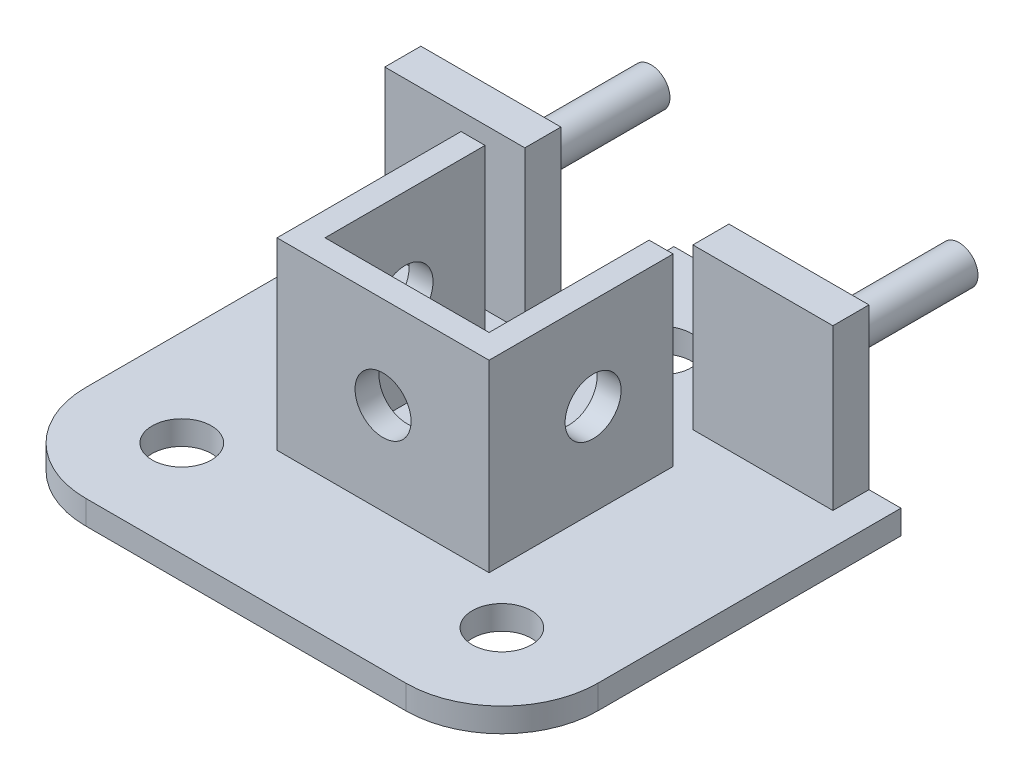
ISO-10303-21;
HEADER;
FILE_DESCRIPTION(('STEP AP214'),'2;1');
FILE_NAME('part.step','',(''),(''),'','','');
FILE_SCHEMA(('AUTOMOTIVE_DESIGN { 1 0 10303 214 1 1 1 1 }'));
ENDSEC;
DATA;
#1=APPLICATION_CONTEXT('core data for automotive mechanical design processes');
#2=APPLICATION_PROTOCOL_DEFINITION('international standard','automotive_design',2000,#1);
#3=PRODUCT_CONTEXT('',#1,'mechanical');
#4=PRODUCT('Part','Part','',(#3));
#5=PRODUCT_RELATED_PRODUCT_CATEGORY('part','',(#4));
#6=PRODUCT_DEFINITION_FORMATION('','',#4);
#7=PRODUCT_DEFINITION_CONTEXT('part definition',#1,'design');
#8=PRODUCT_DEFINITION('design','',#6,#7);
#9=PRODUCT_DEFINITION_SHAPE('','',#8);
#10=(LENGTH_UNIT() NAMED_UNIT(*) SI_UNIT(.MILLI.,.METRE.));
#11=(NAMED_UNIT(*) PLANE_ANGLE_UNIT() SI_UNIT($,.RADIAN.));
#12=(NAMED_UNIT(*) SI_UNIT($,.STERADIAN.) SOLID_ANGLE_UNIT());
#13=UNCERTAINTY_MEASURE_WITH_UNIT(LENGTH_MEASURE(1.E-05),#10,'distance_accuracy_value','');
#14=(GEOMETRIC_REPRESENTATION_CONTEXT(3) GLOBAL_UNCERTAINTY_ASSIGNED_CONTEXT((#13)) GLOBAL_UNIT_ASSIGNED_CONTEXT((#10,
#11,#12)) REPRESENTATION_CONTEXT('',''));
#15=CARTESIAN_POINT('',(0.,0.,0.));
#16=DIRECTION('',(0.,0.,1.));
#17=DIRECTION('',(1.,0.,0.));
#18=AXIS2_PLACEMENT_3D('',#15,#16,#17);
#19=CARTESIAN_POINT('',(0.,3.,0.));
#20=DIRECTION('',(0.,1.,0.));
#21=DIRECTION('',(0.,0.,1.));
#22=AXIS2_PLACEMENT_3D('',#19,#20,#21);
#23=PLANE('',#22);
#24=DIRECTION('',(0.,0.,-1.));
#25=VECTOR('',#24,1.);
#26=CARTESIAN_POINT('',(-13.25,3.,0.));
#27=LINE('',#26,#25);
#28=CARTESIAN_POINT('',(-13.25,3.,-5.15));
#29=VERTEX_POINT('',#28);
#30=CARTESIAN_POINT('',(-13.25,3.,-28.15));
#31=VERTEX_POINT('',#30);
#32=EDGE_CURVE('E212',#29,#31,#27,.T.);
#33=ORIENTED_EDGE('',*,*,#32,.T.);
#34=DIRECTION('',(1.,0.,0.));
#35=VECTOR('',#34,1.);
#36=CARTESIAN_POINT('',(0.,3.,-28.15));
#37=LINE('',#36,#35);
#38=CARTESIAN_POINT('',(-10.25,3.,-28.15));
#39=VERTEX_POINT('',#38);
#40=EDGE_CURVE('E228',#31,#39,#37,.T.);
#41=ORIENTED_EDGE('',*,*,#40,.T.);
#42=DIRECTION('',(0.,0.,-1.));
#43=VECTOR('',#42,1.);
#44=CARTESIAN_POINT('',(-10.25,3.,0.));
#45=LINE('',#44,#43);
#46=CARTESIAN_POINT('',(-10.25,3.,-8.15));
#47=VERTEX_POINT('',#46);
#48=EDGE_CURVE('E230',#47,#39,#45,.T.);
#49=ORIENTED_EDGE('',*,*,#48,.F.);
#50=DIRECTION('',(1.,0.,0.));
#51=VECTOR('',#50,1.);
#52=CARTESIAN_POINT('',(0.,3.,-8.15));
#53=LINE('',#52,#51);
#54=CARTESIAN_POINT('',(10.25,3.,-8.15));
#55=VERTEX_POINT('',#54);
#56=EDGE_CURVE('E257',#47,#55,#53,.T.);
#57=ORIENTED_EDGE('',*,*,#56,.T.);
#58=DIRECTION('',(0.,0.,-1.));
#59=VECTOR('',#58,1.);
#60=CARTESIAN_POINT('',(10.25,3.,0.));
#61=LINE('',#60,#59);
#62=CARTESIAN_POINT('',(10.25,3.,-28.15));
#63=VERTEX_POINT('',#62);
#64=EDGE_CURVE('E255',#55,#63,#61,.T.);
#65=ORIENTED_EDGE('',*,*,#64,.T.);
#66=DIRECTION('',(1.,0.,0.));
#67=VECTOR('',#66,1.);
#68=CARTESIAN_POINT('',(0.,3.,-28.15));
#69=LINE('',#68,#67);
#70=CARTESIAN_POINT('',(13.25,3.,-28.15));
#71=VERTEX_POINT('',#70);
#72=EDGE_CURVE('E253',#63,#71,#69,.T.);
#73=ORIENTED_EDGE('',*,*,#72,.T.);
#74=DIRECTION('',(0.,0.,-1.));
#75=VECTOR('',#74,1.);
#76=CARTESIAN_POINT('',(13.25,3.,0.));
#77=LINE('',#76,#75);
#78=CARTESIAN_POINT('',(13.25,3.,-5.15));
#79=VERTEX_POINT('',#78);
#80=EDGE_CURVE('E60',#79,#71,#77,.T.);
#81=ORIENTED_EDGE('',*,*,#80,.F.);
#82=DIRECTION('',(1.,0.,0.));
#83=VECTOR('',#82,1.);
#84=CARTESIAN_POINT('',(0.,3.,-5.15));
#85=LINE('',#84,#83);
#86=EDGE_CURVE('E55',#29,#79,#85,.T.);
#87=ORIENTED_EDGE('',*,*,#86,.F.);
#88=EDGE_LOOP('',(#33,#41,#49,#57,#65,#73,#81,#87));
#89=FACE_BOUND('',#88,.T.);
#90=DIRECTION('',(0.,0.,-1.));
#91=VECTOR('',#90,1.);
#92=CARTESIAN_POINT('',(-10.5,3.,-37.8767008399383));
#93=LINE('',#92,#91);
#94=CARTESIAN_POINT('',(-10.5,3.,-37.8767008399383));
#95=VERTEX_POINT('',#94);
#96=CARTESIAN_POINT('',(-10.5,3.,-52.));
#97=VERTEX_POINT('',#96);
#98=EDGE_CURVE('E284',#95,#97,#93,.T.);
#99=ORIENTED_EDGE('',*,*,#98,.F.);
#100=DIRECTION('',(0.,0.,-1.));
#101=VECTOR('',#100,1.);
#102=CARTESIAN_POINT('',(-10.5,3.,-37.8767008399383));
#103=LINE('',#102,#101);
#104=CARTESIAN_POINT('',(-10.5,3.,-33.3688732321388));
#105=VERTEX_POINT('',#104);
#106=EDGE_CURVE('E349',#105,#95,#103,.T.);
#107=ORIENTED_EDGE('',*,*,#106,.F.);
#108=DIRECTION('',(1.,0.,0.));
#109=VECTOR('',#108,1.);
#110=CARTESIAN_POINT('',(-28.,3.,-33.3688732321388));
#111=LINE('',#110,#109);
#112=CARTESIAN_POINT('',(-28.,3.,-33.3688732321388));
#113=VERTEX_POINT('',#112);
#114=EDGE_CURVE('E358',#113,#105,#111,.T.);
#115=ORIENTED_EDGE('',*,*,#114,.F.);
#116=DIRECTION('',(0.,0.,1.));
#117=VECTOR('',#116,1.);
#118=CARTESIAN_POINT('',(-28.,3.,-37.8767008399383));
#119=LINE('',#118,#117);
#120=CARTESIAN_POINT('',(-28.,3.,-37.8767008399383));
#121=VERTEX_POINT('',#120);
#122=EDGE_CURVE('E344',#121,#113,#119,.T.);
#123=ORIENTED_EDGE('',*,*,#122,.F.);
#124=DIRECTION('',(1.,0.,0.));
#125=VECTOR('',#124,1.);
#126=CARTESIAN_POINT('',(-32.,3.,-37.8767008399383));
#127=LINE('',#126,#125);
#128=CARTESIAN_POINT('',(-32.,3.,-37.8767008399383));
#129=VERTEX_POINT('',#128);
#130=EDGE_CURVE('E281',#129,#121,#127,.T.);
#131=ORIENTED_EDGE('',*,*,#130,.F.);
#132=DIRECTION('',(0.,0.,-1.));
#133=VECTOR('',#132,1.);
#134=CARTESIAN_POINT('',(-32.,3.,0.));
#135=LINE('',#134,#133);
#136=CARTESIAN_POINT('',(-32.,3.,0.));
#137=VERTEX_POINT('',#136);
#138=EDGE_CURVE('E388',#137,#129,#135,.T.);
#139=ORIENTED_EDGE('',*,*,#138,.F.);
#140=CARTESIAN_POINT('',(-20.,3.,0.));
#141=DIRECTION('',(0.,1.,0.));
#142=DIRECTION('',(0.,0.,1.));
#143=AXIS2_PLACEMENT_3D('',#140,#141,#142);
#144=CIRCLE('',#143,12.);
#145=CARTESIAN_POINT('',(-20.,3.,12.));
#146=VERTEX_POINT('',#145);
#147=EDGE_CURVE('E391',#137,#146,#144,.T.);
#148=ORIENTED_EDGE('',*,*,#147,.T.);
#149=DIRECTION('',(-1.,0.,0.));
#150=VECTOR('',#149,1.);
#151=CARTESIAN_POINT('',(0.,3.,12.));
#152=LINE('',#151,#150);
#153=CARTESIAN_POINT('',(20.,3.,12.));
#154=VERTEX_POINT('',#153);
#155=EDGE_CURVE('E393',#154,#146,#152,.T.);
#156=ORIENTED_EDGE('',*,*,#155,.F.);
#157=CARTESIAN_POINT('',(20.,3.,0.));
#158=DIRECTION('',(0.,1.,0.));
#159=DIRECTION('',(0.,0.,1.));
#160=AXIS2_PLACEMENT_3D('',#157,#158,#159);
#161=CIRCLE('',#160,12.);
#162=CARTESIAN_POINT('',(32.,3.,0.));
#163=VERTEX_POINT('',#162);
#164=EDGE_CURVE('E396',#163,#154,#161,.F.);
#165=ORIENTED_EDGE('',*,*,#164,.F.);
#166=DIRECTION('',(0.,0.,1.));
#167=VECTOR('',#166,1.);
#168=CARTESIAN_POINT('',(32.,3.,0.));
#169=LINE('',#168,#167);
#170=CARTESIAN_POINT('',(32.,3.,-37.8767008399383));
#171=VERTEX_POINT('',#170);
#172=EDGE_CURVE('E383',#171,#163,#169,.T.);
#173=ORIENTED_EDGE('',*,*,#172,.F.);
#174=DIRECTION('',(1.,0.,0.));
#175=VECTOR('',#174,1.);
#176=CARTESIAN_POINT('',(32.,3.,-37.8767008399383));
#177=LINE('',#176,#175);
#178=CARTESIAN_POINT('',(28.,3.,-37.8767008399383));
#179=VERTEX_POINT('',#178);
#180=EDGE_CURVE('E302',#179,#171,#177,.T.);
#181=ORIENTED_EDGE('',*,*,#180,.F.);
#182=DIRECTION('',(0.,0.,-1.));
#183=VECTOR('',#182,1.);
#184=CARTESIAN_POINT('',(28.,3.,-37.8767008399383));
#185=LINE('',#184,#183);
#186=CARTESIAN_POINT('',(28.,3.,-33.3688732321388));
#187=VERTEX_POINT('',#186);
#188=EDGE_CURVE('E321',#187,#179,#185,.T.);
#189=ORIENTED_EDGE('',*,*,#188,.F.);
#190=DIRECTION('',(1.,0.,0.));
#191=VECTOR('',#190,1.);
#192=CARTESIAN_POINT('',(28.,3.,-33.3688732321388));
#193=LINE('',#192,#191);
#194=CARTESIAN_POINT('',(10.5,3.,-33.3688732321388));
#195=VERTEX_POINT('',#194);
#196=EDGE_CURVE('E329',#195,#187,#193,.T.);
#197=ORIENTED_EDGE('',*,*,#196,.F.);
#198=DIRECTION('',(0.,0.,1.));
#199=VECTOR('',#198,1.);
#200=CARTESIAN_POINT('',(10.5,3.,-37.8767008399383));
#201=LINE('',#200,#199);
#202=CARTESIAN_POINT('',(10.5,3.,-37.8767008399383));
#203=VERTEX_POINT('',#202);
#204=EDGE_CURVE('E316',#203,#195,#201,.T.);
#205=ORIENTED_EDGE('',*,*,#204,.F.);
#206=DIRECTION('',(0.,0.,1.));
#207=VECTOR('',#206,1.);
#208=CARTESIAN_POINT('',(10.5,3.,-37.8767008399383));
#209=LINE('',#208,#207);
#210=CARTESIAN_POINT('',(10.5,3.,-52.));
#211=VERTEX_POINT('',#210);
#212=EDGE_CURVE('E300',#211,#203,#209,.T.);
#213=ORIENTED_EDGE('',*,*,#212,.F.);
#214=DIRECTION('',(1.,0.,0.));
#215=VECTOR('',#214,1.);
#216=CARTESIAN_POINT('',(0.,3.,-52.));
#217=LINE('',#216,#215);
#218=EDGE_CURVE('E385',#97,#211,#217,.T.);
#219=ORIENTED_EDGE('',*,*,#218,.F.);
#220=EDGE_LOOP('',(#99,#107,#115,#123,#131,#139,#148,#156,#165,#173,#181,#189,#197,#205,#213,#219));
#221=FACE_BOUND('',#220,.T.);
#222=CARTESIAN_POINT('',(20.,3.,0.));
#223=DIRECTION('',(0.,1.,0.));
#224=DIRECTION('',(0.,0.,1.));
#225=AXIS2_PLACEMENT_3D('',#222,#223,#224);
#226=CIRCLE('',#225,3.7);
#227=CARTESIAN_POINT('',(20.,3.,3.7));
#228=VERTEX_POINT('',#227);
#229=EDGE_CURVE('E373',#228,#228,#226,.T.);
#230=ORIENTED_EDGE('',*,*,#229,.F.);
#231=EDGE_LOOP('',(#230));
#232=FACE_BOUND('',#231,.T.);
#233=CARTESIAN_POINT('',(-20.,3.,0.));
#234=DIRECTION('',(0.,1.,0.));
#235=DIRECTION('',(0.,0.,1.));
#236=AXIS2_PLACEMENT_3D('',#233,#234,#235);
#237=CIRCLE('',#236,3.7);
#238=CARTESIAN_POINT('',(-20.,3.,3.7));
#239=VERTEX_POINT('',#238);
#240=EDGE_CURVE('E376',#239,#239,#237,.T.);
#241=ORIENTED_EDGE('',*,*,#240,.F.);
#242=EDGE_LOOP('',(#241));
#243=FACE_BOUND('',#242,.T.);
#244=CARTESIAN_POINT('',(0.,3.,-40.));
#245=DIRECTION('',(0.,1.,0.));
#246=DIRECTION('',(0.,0.,1.));
#247=AXIS2_PLACEMENT_3D('',#244,#245,#246);
#248=CIRCLE('',#247,3.7);
#249=CARTESIAN_POINT('',(0.,3.,-36.3));
#250=VERTEX_POINT('',#249);
#251=EDGE_CURVE('E380',#250,#250,#248,.T.);
#252=ORIENTED_EDGE('',*,*,#251,.F.);
#253=EDGE_LOOP('',(#252));
#254=FACE_BOUND('',#253,.T.);
#255=ADVANCED_FACE('F39',(#89,#221,#232,#243,#254),#23,.T.);
#256=CARTESIAN_POINT('',(32.,3.,0.));
#257=DIRECTION('',(1.,0.,0.));
#258=DIRECTION('',(0.,0.,-1.));
#259=AXIS2_PLACEMENT_3D('',#256,#257,#258);
#260=PLANE('',#259);
#261=DIRECTION('',(0.,1.,0.));
#262=VECTOR('',#261,1.);
#263=CARTESIAN_POINT('',(32.,-0.00100000000000013,-37.8767008399383));
#264=LINE('',#263,#262);
#265=CARTESIAN_POINT('',(32.,0.,-37.8767008399383));
#266=VERTEX_POINT('',#265);
#267=EDGE_CURVE('E282',#266,#171,#264,.T.);
#268=ORIENTED_EDGE('',*,*,#267,.T.);
#269=ORIENTED_EDGE('',*,*,#172,.T.);
#270=DIRECTION('',(0.,-1.,0.));
#271=VECTOR('',#270,1.);
#272=CARTESIAN_POINT('',(32.,3.,0.));
#273=LINE('',#272,#271);
#274=CARTESIAN_POINT('',(32.,0.,0.));
#275=VERTEX_POINT('',#274);
#276=EDGE_CURVE('E399',#163,#275,#273,.T.);
#277=ORIENTED_EDGE('',*,*,#276,.T.);
#278=DIRECTION('',(0.,0.,1.));
#279=VECTOR('',#278,1.);
#280=CARTESIAN_POINT('',(32.,0.,0.));
#281=LINE('',#280,#279);
#282=EDGE_CURVE('E408',#266,#275,#281,.T.);
#283=ORIENTED_EDGE('',*,*,#282,.F.);
#284=EDGE_LOOP('',(#268,#269,#277,#283));
#285=FACE_BOUND('',#284,.T.);
#286=ADVANCED_FACE('F461',(#285),#260,.T.);
#287=CARTESIAN_POINT('',(0.,3.,-52.));
#288=DIRECTION('',(0.,0.,-1.));
#289=DIRECTION('',(-1.,0.,0.));
#290=AXIS2_PLACEMENT_3D('',#287,#288,#289);
#291=PLANE('',#290);
#292=DIRECTION('',(0.,1.,0.));
#293=VECTOR('',#292,1.);
#294=CARTESIAN_POINT('',(-10.5,-0.00100000000000013,-52.));
#295=LINE('',#294,#293);
#296=CARTESIAN_POINT('',(-10.5,0.,-52.));
#297=VERTEX_POINT('',#296);
#298=EDGE_CURVE('E287',#297,#97,#295,.T.);
#299=ORIENTED_EDGE('',*,*,#298,.T.);
#300=ORIENTED_EDGE('',*,*,#218,.T.);
#301=DIRECTION('',(0.,1.,0.));
#302=VECTOR('',#301,1.);
#303=CARTESIAN_POINT('',(10.5,-0.00100000000000013,-52.));
#304=LINE('',#303,#302);
#305=CARTESIAN_POINT('',(10.5,0.,-52.));
#306=VERTEX_POINT('',#305);
#307=EDGE_CURVE('E304',#306,#211,#304,.T.);
#308=ORIENTED_EDGE('',*,*,#307,.F.);
#309=DIRECTION('',(1.,0.,0.));
#310=VECTOR('',#309,1.);
#311=CARTESIAN_POINT('',(0.,0.,-52.));
#312=LINE('',#311,#310);
#313=EDGE_CURVE('E410',#297,#306,#312,.T.);
#314=ORIENTED_EDGE('',*,*,#313,.F.);
#315=EDGE_LOOP('',(#299,#300,#308,#314));
#316=FACE_BOUND('',#315,.T.);
#317=ADVANCED_FACE('F480',(#316),#291,.T.);
#318=CARTESIAN_POINT('',(-32.,3.,0.));
#319=DIRECTION('',(-1.,0.,0.));
#320=DIRECTION('',(0.,0.,1.));
#321=AXIS2_PLACEMENT_3D('',#318,#319,#320);
#322=PLANE('',#321);
#323=DIRECTION('',(0.,1.,0.));
#324=VECTOR('',#323,1.);
#325=CARTESIAN_POINT('',(-32.,-0.00100000000000013,-37.8767008399383));
#326=LINE('',#325,#324);
#327=CARTESIAN_POINT('',(-32.,0.,-37.8767008399383));
#328=VERTEX_POINT('',#327);
#329=EDGE_CURVE('E286',#328,#129,#326,.T.);
#330=ORIENTED_EDGE('',*,*,#329,.F.);
#331=DIRECTION('',(0.,0.,-1.));
#332=VECTOR('',#331,1.);
#333=CARTESIAN_POINT('',(-32.,0.,0.));
#334=LINE('',#333,#332);
#335=CARTESIAN_POINT('',(-32.,0.,0.));
#336=VERTEX_POINT('',#335);
#337=EDGE_CURVE('E413',#336,#328,#334,.T.);
#338=ORIENTED_EDGE('',*,*,#337,.F.);
#339=DIRECTION('',(0.,-1.,0.));
#340=VECTOR('',#339,1.);
#341=CARTESIAN_POINT('',(-32.,3.,0.));
#342=LINE('',#341,#340);
#343=EDGE_CURVE('E430',#137,#336,#342,.T.);
#344=ORIENTED_EDGE('',*,*,#343,.F.);
#345=ORIENTED_EDGE('',*,*,#138,.T.);
#346=EDGE_LOOP('',(#330,#338,#344,#345));
#347=FACE_BOUND('',#346,.T.);
#348=ADVANCED_FACE('F491',(#347),#322,.T.);
#349=CARTESIAN_POINT('',(-20.,3.,0.));
#350=DIRECTION('',(0.,-1.,0.));
#351=DIRECTION('',(0.,0.,-1.));
#352=AXIS2_PLACEMENT_3D('',#349,#350,#351);
#353=CYLINDRICAL_SURFACE('',#352,12.);
#354=CARTESIAN_POINT('',(-20.,0.,0.));
#355=DIRECTION('',(0.,1.,0.));
#356=DIRECTION('',(0.,0.,1.));
#357=AXIS2_PLACEMENT_3D('',#354,#355,#356);
#358=CIRCLE('',#357,12.);
#359=CARTESIAN_POINT('',(-20.,0.,12.));
#360=VERTEX_POINT('',#359);
#361=EDGE_CURVE('E416',#336,#360,#358,.T.);
#362=ORIENTED_EDGE('',*,*,#361,.T.);
#363=DIRECTION('',(0.,-1.,0.));
#364=VECTOR('',#363,1.);
#365=CARTESIAN_POINT('',(-20.,3.,12.));
#366=LINE('',#365,#364);
#367=EDGE_CURVE('E428',#146,#360,#366,.T.);
#368=ORIENTED_EDGE('',*,*,#367,.F.);
#369=ORIENTED_EDGE('',*,*,#147,.F.);
#370=ORIENTED_EDGE('',*,*,#343,.T.);
#371=EDGE_LOOP('',(#362,#368,#369,#370));
#372=FACE_BOUND('',#371,.T.);
#373=ADVANCED_FACE('F536',(#372),#353,.T.);
#374=CARTESIAN_POINT('',(0.,3.,12.));
#375=DIRECTION('',(0.,0.,1.));
#376=DIRECTION('',(1.,0.,0.));
#377=AXIS2_PLACEMENT_3D('',#374,#375,#376);
#378=PLANE('',#377);
#379=DIRECTION('',(-1.,0.,0.));
#380=VECTOR('',#379,1.);
#381=CARTESIAN_POINT('',(0.,0.,12.));
#382=LINE('',#381,#380);
#383=CARTESIAN_POINT('',(20.,0.,12.));
#384=VERTEX_POINT('',#383);
#385=EDGE_CURVE('E419',#384,#360,#382,.T.);
#386=ORIENTED_EDGE('',*,*,#385,.F.);
#387=DIRECTION('',(0.,-1.,0.));
#388=VECTOR('',#387,1.);
#389=CARTESIAN_POINT('',(20.,3.,12.));
#390=LINE('',#389,#388);
#391=EDGE_CURVE('E426',#154,#384,#390,.T.);
#392=ORIENTED_EDGE('',*,*,#391,.F.);
#393=ORIENTED_EDGE('',*,*,#155,.T.);
#394=ORIENTED_EDGE('',*,*,#367,.T.);
#395=EDGE_LOOP('',(#386,#392,#393,#394));
#396=FACE_BOUND('',#395,.T.);
#397=ADVANCED_FACE('F532',(#396),#378,.T.);
#398=CARTESIAN_POINT('',(0.,3.,-40.));
#399=DIRECTION('',(0.,-1.,0.));
#400=DIRECTION('',(0.,0.,-1.));
#401=AXIS2_PLACEMENT_3D('',#398,#399,#400);
#402=CYLINDRICAL_SURFACE('',#401,3.7);
#403=ORIENTED_EDGE('',*,*,#251,.T.);
#404=EDGE_LOOP('',(#403));
#405=FACE_BOUND('',#404,.T.);
#406=CARTESIAN_POINT('',(0.,0.,-40.));
#407=DIRECTION('',(0.,1.,0.));
#408=DIRECTION('',(0.,0.,1.));
#409=AXIS2_PLACEMENT_3D('',#406,#407,#408);
#410=CIRCLE('',#409,3.7);
#411=CARTESIAN_POINT('',(0.,0.,-36.3));
#412=VERTEX_POINT('',#411);
#413=EDGE_CURVE('E405',#412,#412,#410,.T.);
#414=ORIENTED_EDGE('',*,*,#413,.F.);
#415=EDGE_LOOP('',(#414));
#416=FACE_BOUND('',#415,.T.);
#417=ADVANCED_FACE('F535',(#405,#416),#402,.F.);
#418=CARTESIAN_POINT('',(-20.,3.,0.));
#419=DIRECTION('',(0.,-1.,0.));
#420=DIRECTION('',(0.,0.,-1.));
#421=AXIS2_PLACEMENT_3D('',#418,#419,#420);
#422=CYLINDRICAL_SURFACE('',#421,3.7);
#423=ORIENTED_EDGE('',*,*,#240,.T.);
#424=EDGE_LOOP('',(#423));
#425=FACE_BOUND('',#424,.T.);
#426=CARTESIAN_POINT('',(-20.,0.,0.));
#427=DIRECTION('',(0.,1.,0.));
#428=DIRECTION('',(0.,0.,1.));
#429=AXIS2_PLACEMENT_3D('',#426,#427,#428);
#430=CIRCLE('',#429,3.7);
#431=CARTESIAN_POINT('',(-20.,0.,3.7));
#432=VERTEX_POINT('',#431);
#433=EDGE_CURVE('E402',#432,#432,#430,.T.);
#434=ORIENTED_EDGE('',*,*,#433,.F.);
#435=EDGE_LOOP('',(#434));
#436=FACE_BOUND('',#435,.T.);
#437=ADVANCED_FACE('F546',(#425,#436),#422,.F.);
#438=CARTESIAN_POINT('',(20.,3.,0.));
#439=DIRECTION('',(0.,-1.,0.));
#440=DIRECTION('',(0.,0.,-1.));
#441=AXIS2_PLACEMENT_3D('',#438,#439,#440);
#442=CYLINDRICAL_SURFACE('',#441,3.7);
#443=ORIENTED_EDGE('',*,*,#229,.T.);
#444=EDGE_LOOP('',(#443));
#445=FACE_BOUND('',#444,.T.);
#446=CARTESIAN_POINT('',(20.,0.,0.));
#447=DIRECTION('',(0.,1.,0.));
#448=DIRECTION('',(0.,0.,1.));
#449=AXIS2_PLACEMENT_3D('',#446,#447,#448);
#450=CIRCLE('',#449,3.7);
#451=CARTESIAN_POINT('',(20.,0.,3.7));
#452=VERTEX_POINT('',#451);
#453=EDGE_CURVE('E372',#452,#452,#450,.T.);
#454=ORIENTED_EDGE('',*,*,#453,.F.);
#455=EDGE_LOOP('',(#454));
#456=FACE_BOUND('',#455,.T.);
#457=ADVANCED_FACE('F41',(#445,#456),#442,.F.);
#458=CARTESIAN_POINT('',(20.,3.,0.));
#459=DIRECTION('',(0.,-1.,0.));
#460=DIRECTION('',(0.,0.,-1.));
#461=AXIS2_PLACEMENT_3D('',#458,#459,#460);
#462=CYLINDRICAL_SURFACE('',#461,12.);
#463=CARTESIAN_POINT('',(20.,0.,0.));
#464=DIRECTION('',(0.,1.,0.));
#465=DIRECTION('',(0.,0.,1.));
#466=AXIS2_PLACEMENT_3D('',#463,#464,#465);
#467=CIRCLE('',#466,12.);
#468=EDGE_CURVE('E377',#275,#384,#467,.F.);
#469=ORIENTED_EDGE('',*,*,#468,.F.);
#470=ORIENTED_EDGE('',*,*,#276,.F.);
#471=ORIENTED_EDGE('',*,*,#164,.T.);
#472=ORIENTED_EDGE('',*,*,#391,.T.);
#473=EDGE_LOOP('',(#469,#470,#471,#472));
#474=FACE_BOUND('',#473,.T.);
#475=ADVANCED_FACE('F465',(#474),#462,.T.);
#476=CARTESIAN_POINT('',(0.,0.,0.));
#477=DIRECTION('',(0.,1.,0.));
#478=DIRECTION('',(0.,0.,1.));
#479=AXIS2_PLACEMENT_3D('',#476,#477,#478);
#480=PLANE('',#479);
#481=ORIENTED_EDGE('',*,*,#453,.T.);
#482=EDGE_LOOP('',(#481));
#483=FACE_BOUND('',#482,.T.);
#484=ORIENTED_EDGE('',*,*,#433,.T.);
#485=EDGE_LOOP('',(#484));
#486=FACE_BOUND('',#485,.T.);
#487=ORIENTED_EDGE('',*,*,#413,.T.);
#488=EDGE_LOOP('',(#487));
#489=FACE_BOUND('',#488,.T.);
#490=DIRECTION('',(-1.,0.,0.));
#491=VECTOR('',#490,1.);
#492=CARTESIAN_POINT('',(-32.,0.,-37.8767008399383));
#493=LINE('',#492,#491);
#494=CARTESIAN_POINT('',(-10.5,0.,-37.8767008399383));
#495=VERTEX_POINT('',#494);
#496=EDGE_CURVE('E290',#495,#328,#493,.T.);
#497=ORIENTED_EDGE('',*,*,#496,.F.);
#498=DIRECTION('',(0.,0.,1.));
#499=VECTOR('',#498,1.);
#500=CARTESIAN_POINT('',(-10.5,0.,-37.8767008399383));
#501=LINE('',#500,#499);
#502=EDGE_CURVE('E278',#297,#495,#501,.T.);
#503=ORIENTED_EDGE('',*,*,#502,.F.);
#504=ORIENTED_EDGE('',*,*,#313,.T.);
#505=DIRECTION('',(0.,0.,-1.));
#506=VECTOR('',#505,1.);
#507=CARTESIAN_POINT('',(10.5,0.,-37.8767008399383));
#508=LINE('',#507,#506);
#509=CARTESIAN_POINT('',(10.5,0.,-37.8767008399383));
#510=VERTEX_POINT('',#509);
#511=EDGE_CURVE('E214',#510,#306,#508,.T.);
#512=ORIENTED_EDGE('',*,*,#511,.F.);
#513=DIRECTION('',(-1.,0.,0.));
#514=VECTOR('',#513,1.);
#515=CARTESIAN_POINT('',(32.,0.,-37.8767008399383));
#516=LINE('',#515,#514);
#517=EDGE_CURVE('E297',#266,#510,#516,.T.);
#518=ORIENTED_EDGE('',*,*,#517,.F.);
#519=ORIENTED_EDGE('',*,*,#282,.T.);
#520=ORIENTED_EDGE('',*,*,#468,.T.);
#521=ORIENTED_EDGE('',*,*,#385,.T.);
#522=ORIENTED_EDGE('',*,*,#361,.F.);
#523=ORIENTED_EDGE('',*,*,#337,.T.);
#524=EDGE_LOOP('',(#497,#503,#504,#512,#518,#519,#520,#521,#522,#523));
#525=FACE_BOUND('',#524,.T.);
#526=ADVANCED_FACE('F469',(#483,#486,#489,#525),#480,.F.);
#527=CARTESIAN_POINT('',(-28.,23.,-37.8767008399383));
#528=DIRECTION('',(1.,0.,0.));
#529=DIRECTION('',(0.,0.,-1.));
#530=AXIS2_PLACEMENT_3D('',#527,#528,#529);
#531=PLANE('',#530);
#532=ORIENTED_EDGE('',*,*,#122,.T.);
#533=DIRECTION('',(0.,-1.,0.));
#534=VECTOR('',#533,1.);
#535=CARTESIAN_POINT('',(-28.,23.,-33.3688732321388));
#536=LINE('',#535,#534);
#537=CARTESIAN_POINT('',(-28.,23.,-33.3688732321388));
#538=VERTEX_POINT('',#537);
#539=EDGE_CURVE('E370',#538,#113,#536,.T.);
#540=ORIENTED_EDGE('',*,*,#539,.F.);
#541=DIRECTION('',(0.,0.,1.));
#542=VECTOR('',#541,1.);
#543=CARTESIAN_POINT('',(-28.,23.,-37.8767008399383));
#544=LINE('',#543,#542);
#545=CARTESIAN_POINT('',(-28.,23.,-37.8767008399383));
#546=VERTEX_POINT('',#545);
#547=EDGE_CURVE('E345',#546,#538,#544,.T.);
#548=ORIENTED_EDGE('',*,*,#547,.F.);
#549=DIRECTION('',(0.,-1.,0.));
#550=VECTOR('',#549,1.);
#551=CARTESIAN_POINT('',(-28.,23.,-37.8767008399383));
#552=LINE('',#551,#550);
#553=EDGE_CURVE('E355',#546,#121,#552,.T.);
#554=ORIENTED_EDGE('',*,*,#553,.T.);
#555=EDGE_LOOP('',(#532,#540,#548,#554));
#556=FACE_BOUND('',#555,.T.);
#557=ADVANCED_FACE('F501',(#556),#531,.F.);
#558=CARTESIAN_POINT('',(-28.,23.,-33.3688732321388));
#559=DIRECTION('',(0.,0.,-1.));
#560=DIRECTION('',(-1.,0.,0.));
#561=AXIS2_PLACEMENT_3D('',#558,#559,#560);
#562=PLANE('',#561);
#563=ORIENTED_EDGE('',*,*,#114,.T.);
#564=DIRECTION('',(0.,-1.,0.));
#565=VECTOR('',#564,1.);
#566=CARTESIAN_POINT('',(-10.5,23.,-33.3688732321388));
#567=LINE('',#566,#565);
#568=CARTESIAN_POINT('',(-10.5,23.,-33.3688732321388));
#569=VERTEX_POINT('',#568);
#570=EDGE_CURVE('E367',#569,#105,#567,.T.);
#571=ORIENTED_EDGE('',*,*,#570,.F.);
#572=DIRECTION('',(1.,0.,0.));
#573=VECTOR('',#572,1.);
#574=CARTESIAN_POINT('',(-28.,23.,-33.3688732321388));
#575=LINE('',#574,#573);
#576=EDGE_CURVE('E348',#538,#569,#575,.T.);
#577=ORIENTED_EDGE('',*,*,#576,.F.);
#578=ORIENTED_EDGE('',*,*,#539,.T.);
#579=EDGE_LOOP('',(#563,#571,#577,#578));
#580=FACE_BOUND('',#579,.T.);
#581=ADVANCED_FACE('F511',(#580),#562,.F.);
#582=CARTESIAN_POINT('',(-10.5,23.,-37.8767008399383));
#583=DIRECTION('',(-1.,0.,0.));
#584=DIRECTION('',(0.,0.,1.));
#585=AXIS2_PLACEMENT_3D('',#582,#583,#584);
#586=PLANE('',#585);
#587=ORIENTED_EDGE('',*,*,#106,.T.);
#588=DIRECTION('',(0.,-1.,0.));
#589=VECTOR('',#588,1.);
#590=CARTESIAN_POINT('',(-10.5,23.,-37.8767008399383));
#591=LINE('',#590,#589);
#592=CARTESIAN_POINT('',(-10.5,23.,-37.8767008399383));
#593=VERTEX_POINT('',#592);
#594=EDGE_CURVE('E364',#593,#95,#591,.T.);
#595=ORIENTED_EDGE('',*,*,#594,.F.);
#596=DIRECTION('',(0.,0.,-1.));
#597=VECTOR('',#596,1.);
#598=CARTESIAN_POINT('',(-10.5,23.,-37.8767008399383));
#599=LINE('',#598,#597);
#600=EDGE_CURVE('E351',#569,#593,#599,.T.);
#601=ORIENTED_EDGE('',*,*,#600,.F.);
#602=ORIENTED_EDGE('',*,*,#570,.T.);
#603=EDGE_LOOP('',(#587,#595,#601,#602));
#604=FACE_BOUND('',#603,.T.);
#605=ADVANCED_FACE('F509',(#604),#586,.F.);
#606=CARTESIAN_POINT('',(-28.,23.,-37.8767008399383));
#607=DIRECTION('',(0.,0.,1.));
#608=DIRECTION('',(1.,0.,0.));
#609=AXIS2_PLACEMENT_3D('',#606,#607,#608);
#610=PLANE('',#609);
#611=CARTESIAN_POINT('',(-19.25,13.,-37.8767008399383));
#612=DIRECTION('',(0.,0.,1.));
#613=DIRECTION('',(1.,0.,0.));
#614=AXIS2_PLACEMENT_3D('',#611,#612,#613);
#615=CIRCLE('',#614,2.375);
#616=CARTESIAN_POINT('',(-16.875,13.,-37.8767008399383));
#617=VERTEX_POINT('',#616);
#618=EDGE_CURVE('E11',#617,#617,#615,.F.);
#619=ORIENTED_EDGE('',*,*,#618,.F.);
#620=EDGE_LOOP('',(#619));
#621=FACE_BOUND('',#620,.T.);
#622=ORIENTED_EDGE('',*,*,#594,.T.);
#623=DIRECTION('',(0.,1.,0.));
#624=VECTOR('',#623,1.);
#625=CARTESIAN_POINT('',(-10.5,-0.00100000000000013,-37.8767008399383));
#626=LINE('',#625,#624);
#627=EDGE_CURVE('E291',#495,#95,#626,.T.);
#628=ORIENTED_EDGE('',*,*,#627,.F.);
#629=ORIENTED_EDGE('',*,*,#496,.T.);
#630=ORIENTED_EDGE('',*,*,#329,.T.);
#631=ORIENTED_EDGE('',*,*,#130,.T.);
#632=ORIENTED_EDGE('',*,*,#553,.F.);
#633=DIRECTION('',(-1.,0.,0.));
#634=VECTOR('',#633,1.);
#635=CARTESIAN_POINT('',(-28.,23.,-37.8767008399383));
#636=LINE('',#635,#634);
#637=EDGE_CURVE('E353',#593,#546,#636,.T.);
#638=ORIENTED_EDGE('',*,*,#637,.F.);
#639=EDGE_LOOP('',(#622,#628,#629,#630,#631,#632,#638));
#640=FACE_BOUND('',#639,.T.);
#641=ADVANCED_FACE('F488',(#621,#640),#610,.F.);
#642=CARTESIAN_POINT('',(0.,23.,0.));
#643=DIRECTION('',(0.,1.,0.));
#644=DIRECTION('',(0.,0.,1.));
#645=AXIS2_PLACEMENT_3D('',#642,#643,#644);
#646=PLANE('',#645);
#647=ORIENTED_EDGE('',*,*,#547,.T.);
#648=ORIENTED_EDGE('',*,*,#576,.T.);
#649=ORIENTED_EDGE('',*,*,#600,.T.);
#650=ORIENTED_EDGE('',*,*,#637,.T.);
#651=EDGE_LOOP('',(#647,#648,#649,#650));
#652=FACE_BOUND('',#651,.T.);
#653=ADVANCED_FACE('F441',(#652),#646,.T.);
#654=CARTESIAN_POINT('',(28.,23.,-37.8767008399383));
#655=DIRECTION('',(0.,0.,1.));
#656=DIRECTION('',(1.,0.,0.));
#657=AXIS2_PLACEMENT_3D('',#654,#655,#656);
#658=PLANE('',#657);
#659=CARTESIAN_POINT('',(19.25,13.,-37.8767008399383));
#660=DIRECTION('',(0.,0.,1.));
#661=DIRECTION('',(1.,0.,0.));
#662=AXIS2_PLACEMENT_3D('',#659,#660,#661);
#663=CIRCLE('',#662,2.375);
#664=CARTESIAN_POINT('',(21.625,13.,-37.8767008399383));
#665=VERTEX_POINT('',#664);
#666=EDGE_CURVE('E48',#665,#665,#663,.F.);
#667=ORIENTED_EDGE('',*,*,#666,.F.);
#668=EDGE_LOOP('',(#667));
#669=FACE_BOUND('',#668,.T.);
#670=DIRECTION('',(0.,-1.,0.));
#671=VECTOR('',#670,1.);
#672=CARTESIAN_POINT('',(28.,23.,-37.8767008399383));
#673=LINE('',#672,#671);
#674=CARTESIAN_POINT('',(28.,23.,-37.8767008399383));
#675=VERTEX_POINT('',#674);
#676=EDGE_CURVE('E327',#675,#179,#673,.T.);
#677=ORIENTED_EDGE('',*,*,#676,.T.);
#678=ORIENTED_EDGE('',*,*,#180,.T.);
#679=ORIENTED_EDGE('',*,*,#267,.F.);
#680=ORIENTED_EDGE('',*,*,#517,.T.);
#681=DIRECTION('',(0.,1.,0.));
#682=VECTOR('',#681,1.);
#683=CARTESIAN_POINT('',(10.5,-0.00100000000000013,-37.8767008399383));
#684=LINE('',#683,#682);
#685=EDGE_CURVE('E307',#510,#203,#684,.T.);
#686=ORIENTED_EDGE('',*,*,#685,.T.);
#687=DIRECTION('',(0.,-1.,0.));
#688=VECTOR('',#687,1.);
#689=CARTESIAN_POINT('',(10.5,23.,-37.8767008399383));
#690=LINE('',#689,#688);
#691=CARTESIAN_POINT('',(10.5,23.,-37.8767008399383));
#692=VERTEX_POINT('',#691);
#693=EDGE_CURVE('E341',#692,#203,#690,.T.);
#694=ORIENTED_EDGE('',*,*,#693,.F.);
#695=DIRECTION('',(-1.,0.,0.));
#696=VECTOR('',#695,1.);
#697=CARTESIAN_POINT('',(28.,23.,-37.8767008399383));
#698=LINE('',#697,#696);
#699=EDGE_CURVE('E317',#675,#692,#698,.T.);
#700=ORIENTED_EDGE('',*,*,#699,.F.);
#701=EDGE_LOOP('',(#677,#678,#679,#680,#686,#694,#700));
#702=FACE_BOUND('',#701,.T.);
#703=ADVANCED_FACE('F437',(#669,#702),#658,.F.);
#704=CARTESIAN_POINT('',(10.5,23.,-37.8767008399383));
#705=DIRECTION('',(1.,0.,0.));
#706=DIRECTION('',(0.,0.,-1.));
#707=AXIS2_PLACEMENT_3D('',#704,#705,#706);
#708=PLANE('',#707);
#709=ORIENTED_EDGE('',*,*,#204,.T.);
#710=DIRECTION('',(0.,-1.,0.));
#711=VECTOR('',#710,1.);
#712=CARTESIAN_POINT('',(10.5,23.,-33.3688732321388));
#713=LINE('',#712,#711);
#714=CARTESIAN_POINT('',(10.5,23.,-33.3688732321388));
#715=VERTEX_POINT('',#714);
#716=EDGE_CURVE('E338',#715,#195,#713,.T.);
#717=ORIENTED_EDGE('',*,*,#716,.F.);
#718=DIRECTION('',(0.,0.,1.));
#719=VECTOR('',#718,1.);
#720=CARTESIAN_POINT('',(10.5,23.,-37.8767008399383));
#721=LINE('',#720,#719);
#722=EDGE_CURVE('E320',#692,#715,#721,.T.);
#723=ORIENTED_EDGE('',*,*,#722,.F.);
#724=ORIENTED_EDGE('',*,*,#693,.T.);
#725=EDGE_LOOP('',(#709,#717,#723,#724));
#726=FACE_BOUND('',#725,.T.);
#727=ADVANCED_FACE('F440',(#726),#708,.F.);
#728=CARTESIAN_POINT('',(28.,23.,-33.3688732321388));
#729=DIRECTION('',(0.,0.,-1.));
#730=DIRECTION('',(-1.,0.,0.));
#731=AXIS2_PLACEMENT_3D('',#728,#729,#730);
#732=PLANE('',#731);
#733=ORIENTED_EDGE('',*,*,#196,.T.);
#734=DIRECTION('',(0.,-1.,0.));
#735=VECTOR('',#734,1.);
#736=CARTESIAN_POINT('',(28.,23.,-33.3688732321388));
#737=LINE('',#736,#735);
#738=CARTESIAN_POINT('',(28.,23.,-33.3688732321388));
#739=VERTEX_POINT('',#738);
#740=EDGE_CURVE('E336',#739,#187,#737,.T.);
#741=ORIENTED_EDGE('',*,*,#740,.F.);
#742=DIRECTION('',(1.,0.,0.));
#743=VECTOR('',#742,1.);
#744=CARTESIAN_POINT('',(28.,23.,-33.3688732321388));
#745=LINE('',#744,#743);
#746=EDGE_CURVE('E323',#715,#739,#745,.T.);
#747=ORIENTED_EDGE('',*,*,#746,.F.);
#748=ORIENTED_EDGE('',*,*,#716,.T.);
#749=EDGE_LOOP('',(#733,#741,#747,#748));
#750=FACE_BOUND('',#749,.T.);
#751=ADVANCED_FACE('F618',(#750),#732,.F.);
#752=CARTESIAN_POINT('',(28.,23.,-37.8767008399383));
#753=DIRECTION('',(-1.,0.,0.));
#754=DIRECTION('',(0.,0.,1.));
#755=AXIS2_PLACEMENT_3D('',#752,#753,#754);
#756=PLANE('',#755);
#757=ORIENTED_EDGE('',*,*,#188,.T.);
#758=ORIENTED_EDGE('',*,*,#676,.F.);
#759=DIRECTION('',(0.,0.,-1.));
#760=VECTOR('',#759,1.);
#761=CARTESIAN_POINT('',(28.,23.,-37.8767008399383));
#762=LINE('',#761,#760);
#763=EDGE_CURVE('E325',#739,#675,#762,.T.);
#764=ORIENTED_EDGE('',*,*,#763,.F.);
#765=ORIENTED_EDGE('',*,*,#740,.T.);
#766=EDGE_LOOP('',(#757,#758,#764,#765));
#767=FACE_BOUND('',#766,.T.);
#768=ADVANCED_FACE('F448',(#767),#756,.F.);
#769=CARTESIAN_POINT('',(0.,23.,0.));
#770=DIRECTION('',(0.,1.,0.));
#771=DIRECTION('',(0.,0.,1.));
#772=AXIS2_PLACEMENT_3D('',#769,#770,#771);
#773=PLANE('',#772);
#774=ORIENTED_EDGE('',*,*,#699,.T.);
#775=ORIENTED_EDGE('',*,*,#722,.T.);
#776=ORIENTED_EDGE('',*,*,#746,.T.);
#777=ORIENTED_EDGE('',*,*,#763,.T.);
#778=EDGE_LOOP('',(#774,#775,#776,#777));
#779=FACE_BOUND('',#778,.T.);
#780=ADVANCED_FACE('F629',(#779),#773,.T.);
#781=CARTESIAN_POINT('',(19.25,13.,-57.8767008399383));
#782=DIRECTION('',(0.,0.,1.));
#783=DIRECTION('',(1.,0.,0.));
#784=AXIS2_PLACEMENT_3D('',#781,#782,#783);
#785=CYLINDRICAL_SURFACE('',#784,2.375);
#786=CARTESIAN_POINT('',(19.25,13.,-57.8767008399383));
#787=DIRECTION('',(0.,0.,-1.));
#788=DIRECTION('',(-1.,0.,0.));
#789=AXIS2_PLACEMENT_3D('',#786,#787,#788);
#790=CIRCLE('',#789,2.375);
#791=CARTESIAN_POINT('',(16.875,13.,-57.8767008399383));
#792=VERTEX_POINT('',#791);
#793=EDGE_CURVE('E313',#792,#792,#790,.T.);
#794=ORIENTED_EDGE('',*,*,#793,.F.);
#795=EDGE_LOOP('',(#794));
#796=FACE_BOUND('',#795,.T.);
#797=ORIENTED_EDGE('',*,*,#666,.T.);
#798=EDGE_LOOP('',(#797));
#799=FACE_BOUND('',#798,.T.);
#800=ADVANCED_FACE('F435',(#796,#799),#785,.T.);
#801=CARTESIAN_POINT('',(0.,0.,-57.8767008399383));
#802=DIRECTION('',(0.,0.,-1.));
#803=DIRECTION('',(-1.,0.,0.));
#804=AXIS2_PLACEMENT_3D('',#801,#802,#803);
#805=PLANE('',#804);
#806=ORIENTED_EDGE('',*,*,#793,.T.);
#807=EDGE_LOOP('',(#806));
#808=FACE_BOUND('',#807,.T.);
#809=ADVANCED_FACE('F786',(#808),#805,.T.);
#810=CARTESIAN_POINT('',(-19.25,13.,-57.8767008399383));
#811=DIRECTION('',(0.,0.,1.));
#812=DIRECTION('',(1.,0.,0.));
#813=AXIS2_PLACEMENT_3D('',#810,#811,#812);
#814=CYLINDRICAL_SURFACE('',#813,2.375);
#815=CARTESIAN_POINT('',(-19.25,13.,-57.8767008399383));
#816=DIRECTION('',(0.,0.,-1.));
#817=DIRECTION('',(-1.,0.,0.));
#818=AXIS2_PLACEMENT_3D('',#815,#816,#817);
#819=CIRCLE('',#818,2.375);
#820=CARTESIAN_POINT('',(-21.625,13.,-57.8767008399383));
#821=VERTEX_POINT('',#820);
#822=EDGE_CURVE('E295',#821,#821,#819,.T.);
#823=ORIENTED_EDGE('',*,*,#822,.F.);
#824=EDGE_LOOP('',(#823));
#825=FACE_BOUND('',#824,.T.);
#826=ORIENTED_EDGE('',*,*,#618,.T.);
#827=EDGE_LOOP('',(#826));
#828=FACE_BOUND('',#827,.T.);
#829=ADVANCED_FACE('F782',(#825,#828),#814,.T.);
#830=CARTESIAN_POINT('',(0.,0.,-57.8767008399383));
#831=DIRECTION('',(0.,0.,-1.));
#832=DIRECTION('',(-1.,0.,0.));
#833=AXIS2_PLACEMENT_3D('',#830,#831,#832);
#834=PLANE('',#833);
#835=ORIENTED_EDGE('',*,*,#822,.T.);
#836=EDGE_LOOP('',(#835));
#837=FACE_BOUND('',#836,.T.);
#838=ADVANCED_FACE('F640',(#837),#834,.T.);
#839=CARTESIAN_POINT('',(10.5,-0.00100000000000013,-37.8767008399383));
#840=DIRECTION('',(-1.,0.,0.));
#841=DIRECTION('',(0.,0.,1.));
#842=AXIS2_PLACEMENT_3D('',#839,#840,#841);
#843=PLANE('',#842);
#844=ORIENTED_EDGE('',*,*,#511,.T.);
#845=ORIENTED_EDGE('',*,*,#307,.T.);
#846=ORIENTED_EDGE('',*,*,#212,.T.);
#847=ORIENTED_EDGE('',*,*,#685,.F.);
#848=EDGE_LOOP('',(#844,#845,#846,#847));
#849=FACE_BOUND('',#848,.T.);
#850=ADVANCED_FACE('F636',(#849),#843,.F.);
#851=CARTESIAN_POINT('',(-10.5,-0.00100000000000013,-37.8767008399383));
#852=DIRECTION('',(1.,0.,0.));
#853=DIRECTION('',(0.,0.,-1.));
#854=AXIS2_PLACEMENT_3D('',#851,#852,#853);
#855=PLANE('',#854);
#856=ORIENTED_EDGE('',*,*,#502,.T.);
#857=ORIENTED_EDGE('',*,*,#627,.T.);
#858=ORIENTED_EDGE('',*,*,#98,.T.);
#859=ORIENTED_EDGE('',*,*,#298,.F.);
#860=EDGE_LOOP('',(#856,#857,#858,#859));
#861=FACE_BOUND('',#860,.T.);
#862=ADVANCED_FACE('F484',(#861),#855,.F.);
#863=CARTESIAN_POINT('',(-13.25,26.,0.));
#864=DIRECTION('',(-1.,0.,0.));
#865=DIRECTION('',(0.,0.,1.));
#866=AXIS2_PLACEMENT_3D('',#863,#864,#865);
#867=PLANE('',#866);
#868=CARTESIAN_POINT('',(-13.25,14.5,-18.15));
#869=DIRECTION('',(-1.,0.,0.));
#870=DIRECTION('',(0.,0.,1.));
#871=AXIS2_PLACEMENT_3D('',#868,#869,#870);
#872=CIRCLE('',#871,3.5);
#873=CARTESIAN_POINT('',(-13.25,14.5,-14.65));
#874=VERTEX_POINT('',#873);
#875=EDGE_CURVE('E910',#874,#874,#872,.T.);
#876=ORIENTED_EDGE('',*,*,#875,.F.);
#877=EDGE_LOOP('',(#876));
#878=FACE_BOUND('',#877,.T.);
#879=ORIENTED_EDGE('',*,*,#32,.F.);
#880=DIRECTION('',(0.,-1.,0.));
#881=VECTOR('',#880,1.);
#882=CARTESIAN_POINT('',(-13.25,26.,-5.15));
#883=LINE('',#882,#881);
#884=CARTESIAN_POINT('',(-13.25,26.,-5.15));
#885=VERTEX_POINT('',#884);
#886=EDGE_CURVE('E205',#885,#29,#883,.T.);
#887=ORIENTED_EDGE('',*,*,#886,.F.);
#888=DIRECTION('',(0.,0.,-1.));
#889=VECTOR('',#888,1.);
#890=CARTESIAN_POINT('',(-13.25,26.,0.));
#891=LINE('',#890,#889);
#892=CARTESIAN_POINT('',(-13.25,26.,-28.15));
#893=VERTEX_POINT('',#892);
#894=EDGE_CURVE('E210',#885,#893,#891,.T.);
#895=ORIENTED_EDGE('',*,*,#894,.T.);
#896=DIRECTION('',(0.,-1.,0.));
#897=VECTOR('',#896,1.);
#898=CARTESIAN_POINT('',(-13.25,26.,-28.15));
#899=LINE('',#898,#897);
#900=EDGE_CURVE('E249',#893,#31,#899,.T.);
#901=ORIENTED_EDGE('',*,*,#900,.T.);
#902=EDGE_LOOP('',(#879,#887,#895,#901));
#903=FACE_BOUND('',#902,.T.);
#904=ADVANCED_FACE('F207',(#878,#903),#867,.T.);
#905=CARTESIAN_POINT('',(0.,26.,-5.15));
#906=DIRECTION('',(0.,0.,-1.));
#907=DIRECTION('',(-1.,0.,0.));
#908=AXIS2_PLACEMENT_3D('',#905,#906,#907);
#909=PLANE('',#908);
#910=CARTESIAN_POINT('',(0.,14.5,-5.15));
#911=DIRECTION('',(0.,0.,1.));
#912=DIRECTION('',(1.,0.,0.));
#913=AXIS2_PLACEMENT_3D('',#910,#911,#912);
#914=CIRCLE('',#913,3.5);
#915=CARTESIAN_POINT('',(3.5,14.5,-5.15));
#916=VERTEX_POINT('',#915);
#917=EDGE_CURVE('E909',#916,#916,#914,.T.);
#918=ORIENTED_EDGE('',*,*,#917,.F.);
#919=EDGE_LOOP('',(#918));
#920=FACE_BOUND('',#919,.T.);
#921=ORIENTED_EDGE('',*,*,#86,.T.);
#922=DIRECTION('',(0.,-1.,0.));
#923=VECTOR('',#922,1.);
#924=CARTESIAN_POINT('',(13.25,26.,-5.15));
#925=LINE('',#924,#923);
#926=CARTESIAN_POINT('',(13.25,26.,-5.15));
#927=VERTEX_POINT('',#926);
#928=EDGE_CURVE('E215',#927,#79,#925,.T.);
#929=ORIENTED_EDGE('',*,*,#928,.F.);
#930=DIRECTION('',(1.,0.,0.));
#931=VECTOR('',#930,1.);
#932=CARTESIAN_POINT('',(0.,26.,-5.15));
#933=LINE('',#932,#931);
#934=EDGE_CURVE('E218',#885,#927,#933,.T.);
#935=ORIENTED_EDGE('',*,*,#934,.F.);
#936=ORIENTED_EDGE('',*,*,#886,.T.);
#937=EDGE_LOOP('',(#921,#929,#935,#936));
#938=FACE_BOUND('',#937,.T.);
#939=ADVANCED_FACE('F219',(#920,#938),#909,.F.);
#940=CARTESIAN_POINT('',(13.25,26.,0.));
#941=DIRECTION('',(-1.,0.,0.));
#942=DIRECTION('',(0.,0.,1.));
#943=AXIS2_PLACEMENT_3D('',#940,#941,#942);
#944=PLANE('',#943);
#945=CARTESIAN_POINT('',(13.25,14.5,-18.15));
#946=DIRECTION('',(-1.,0.,0.));
#947=DIRECTION('',(0.,0.,1.));
#948=AXIS2_PLACEMENT_3D('',#945,#946,#947);
#949=CIRCLE('',#948,3.5);
#950=CARTESIAN_POINT('',(13.25,14.5,-14.65));
#951=VERTEX_POINT('',#950);
#952=EDGE_CURVE('E913',#951,#951,#949,.F.);
#953=ORIENTED_EDGE('',*,*,#952,.F.);
#954=EDGE_LOOP('',(#953));
#955=FACE_BOUND('',#954,.T.);
#956=ORIENTED_EDGE('',*,*,#80,.T.);
#957=DIRECTION('',(0.,-1.,0.));
#958=VECTOR('',#957,1.);
#959=CARTESIAN_POINT('',(13.25,26.,-28.15));
#960=LINE('',#959,#958);
#961=CARTESIAN_POINT('',(13.25,26.,-28.15));
#962=VERTEX_POINT('',#961);
#963=EDGE_CURVE('E274',#962,#71,#960,.T.);
#964=ORIENTED_EDGE('',*,*,#963,.F.);
#965=DIRECTION('',(0.,0.,-1.));
#966=VECTOR('',#965,1.);
#967=CARTESIAN_POINT('',(13.25,26.,0.));
#968=LINE('',#967,#966);
#969=EDGE_CURVE('E223',#927,#962,#968,.T.);
#970=ORIENTED_EDGE('',*,*,#969,.F.);
#971=ORIENTED_EDGE('',*,*,#928,.T.);
#972=EDGE_LOOP('',(#956,#964,#970,#971));
#973=FACE_BOUND('',#972,.T.);
#974=ADVANCED_FACE('F666',(#955,#973),#944,.F.);
#975=CARTESIAN_POINT('',(0.,26.,-28.15));
#976=DIRECTION('',(0.,0.,-1.));
#977=DIRECTION('',(-1.,0.,0.));
#978=AXIS2_PLACEMENT_3D('',#975,#976,#977);
#979=PLANE('',#978);
#980=ORIENTED_EDGE('',*,*,#72,.F.);
#981=DIRECTION('',(0.,-1.,0.));
#982=VECTOR('',#981,1.);
#983=CARTESIAN_POINT('',(10.25,26.,-28.15));
#984=LINE('',#983,#982);
#985=CARTESIAN_POINT('',(10.25,26.,-28.15));
#986=VERTEX_POINT('',#985);
#987=EDGE_CURVE('E271',#986,#63,#984,.T.);
#988=ORIENTED_EDGE('',*,*,#987,.F.);
#989=DIRECTION('',(1.,0.,0.));
#990=VECTOR('',#989,1.);
#991=CARTESIAN_POINT('',(0.,26.,-28.15));
#992=LINE('',#991,#990);
#993=EDGE_CURVE('E237',#986,#962,#992,.T.);
#994=ORIENTED_EDGE('',*,*,#993,.T.);
#995=ORIENTED_EDGE('',*,*,#963,.T.);
#996=EDGE_LOOP('',(#980,#988,#994,#995));
#997=FACE_BOUND('',#996,.T.);
#998=ADVANCED_FACE('F660',(#997),#979,.T.);
#999=CARTESIAN_POINT('',(10.25,26.,0.));
#1000=DIRECTION('',(-1.,0.,0.));
#1001=DIRECTION('',(0.,0.,1.));
#1002=AXIS2_PLACEMENT_3D('',#999,#1000,#1001);
#1003=PLANE('',#1002);
#1004=CARTESIAN_POINT('',(10.25,14.5,-18.15));
#1005=DIRECTION('',(-1.,0.,0.));
#1006=DIRECTION('',(0.,0.,1.));
#1007=AXIS2_PLACEMENT_3D('',#1004,#1005,#1006);
#1008=CIRCLE('',#1007,3.5);
#1009=CARTESIAN_POINT('',(10.25,14.5,-14.65));
#1010=VERTEX_POINT('',#1009);
#1011=EDGE_CURVE('E233',#1010,#1010,#1008,.T.);
#1012=ORIENTED_EDGE('',*,*,#1011,.F.);
#1013=EDGE_LOOP('',(#1012));
#1014=FACE_BOUND('',#1013,.T.);
#1015=ORIENTED_EDGE('',*,*,#64,.F.);
#1016=DIRECTION('',(0.,-1.,0.));
#1017=VECTOR('',#1016,1.);
#1018=CARTESIAN_POINT('',(10.25,26.,-8.15));
#1019=LINE('',#1018,#1017);
#1020=CARTESIAN_POINT('',(10.25,26.,-8.15));
#1021=VERTEX_POINT('',#1020);
#1022=EDGE_CURVE('E268',#1021,#55,#1019,.T.);
#1023=ORIENTED_EDGE('',*,*,#1022,.F.);
#1024=DIRECTION('',(0.,0.,-1.));
#1025=VECTOR('',#1024,1.);
#1026=CARTESIAN_POINT('',(10.25,26.,0.));
#1027=LINE('',#1026,#1025);
#1028=EDGE_CURVE('E240',#1021,#986,#1027,.T.);
#1029=ORIENTED_EDGE('',*,*,#1028,.T.);
#1030=ORIENTED_EDGE('',*,*,#987,.T.);
#1031=EDGE_LOOP('',(#1015,#1023,#1029,#1030));
#1032=FACE_BOUND('',#1031,.T.);
#1033=ADVANCED_FACE('F665',(#1014,#1032),#1003,.T.);
#1034=CARTESIAN_POINT('',(0.,26.,-8.15));
#1035=DIRECTION('',(0.,0.,-1.));
#1036=DIRECTION('',(-1.,0.,0.));
#1037=AXIS2_PLACEMENT_3D('',#1034,#1035,#1036);
#1038=PLANE('',#1037);
#1039=CARTESIAN_POINT('',(0.,14.5,-8.15));
#1040=DIRECTION('',(0.,0.,-1.));
#1041=DIRECTION('',(-1.,0.,0.));
#1042=AXIS2_PLACEMENT_3D('',#1039,#1040,#1041);
#1043=CIRCLE('',#1042,3.5);
#1044=CARTESIAN_POINT('',(-3.5,14.5,-8.15));
#1045=VERTEX_POINT('',#1044);
#1046=EDGE_CURVE('E906',#1045,#1045,#1043,.F.);
#1047=ORIENTED_EDGE('',*,*,#1046,.T.);
#1048=EDGE_LOOP('',(#1047));
#1049=FACE_BOUND('',#1048,.T.);
#1050=ORIENTED_EDGE('',*,*,#56,.F.);
#1051=DIRECTION('',(0.,-1.,0.));
#1052=VECTOR('',#1051,1.);
#1053=CARTESIAN_POINT('',(-10.25,26.,-8.15));
#1054=LINE('',#1053,#1052);
#1055=CARTESIAN_POINT('',(-10.25,26.,-8.15));
#1056=VERTEX_POINT('',#1055);
#1057=EDGE_CURVE('E265',#1056,#47,#1054,.T.);
#1058=ORIENTED_EDGE('',*,*,#1057,.F.);
#1059=DIRECTION('',(1.,0.,0.));
#1060=VECTOR('',#1059,1.);
#1061=CARTESIAN_POINT('',(0.,26.,-8.15));
#1062=LINE('',#1061,#1060);
#1063=EDGE_CURVE('E243',#1056,#1021,#1062,.T.);
#1064=ORIENTED_EDGE('',*,*,#1063,.T.);
#1065=ORIENTED_EDGE('',*,*,#1022,.T.);
#1066=EDGE_LOOP('',(#1050,#1058,#1064,#1065));
#1067=FACE_BOUND('',#1066,.T.);
#1068=ADVANCED_FACE('F722',(#1049,#1067),#1038,.T.);
#1069=CARTESIAN_POINT('',(-10.25,26.,0.));
#1070=DIRECTION('',(-1.,0.,0.));
#1071=DIRECTION('',(0.,0.,1.));
#1072=AXIS2_PLACEMENT_3D('',#1069,#1070,#1071);
#1073=PLANE('',#1072);
#1074=CARTESIAN_POINT('',(-10.25,14.5,-18.15));
#1075=DIRECTION('',(-1.,0.,0.));
#1076=DIRECTION('',(0.,0.,1.));
#1077=AXIS2_PLACEMENT_3D('',#1074,#1075,#1076);
#1078=CIRCLE('',#1077,3.5);
#1079=CARTESIAN_POINT('',(-10.25,14.5,-14.65));
#1080=VERTEX_POINT('',#1079);
#1081=EDGE_CURVE('E43',#1080,#1080,#1078,.T.);
#1082=ORIENTED_EDGE('',*,*,#1081,.T.);
#1083=EDGE_LOOP('',(#1082));
#1084=FACE_BOUND('',#1083,.T.);
#1085=ORIENTED_EDGE('',*,*,#48,.T.);
#1086=DIRECTION('',(0.,-1.,0.));
#1087=VECTOR('',#1086,1.);
#1088=CARTESIAN_POINT('',(-10.25,26.,-28.15));
#1089=LINE('',#1088,#1087);
#1090=CARTESIAN_POINT('',(-10.25,26.,-28.15));
#1091=VERTEX_POINT('',#1090);
#1092=EDGE_CURVE('E262',#1091,#39,#1089,.T.);
#1093=ORIENTED_EDGE('',*,*,#1092,.F.);
#1094=DIRECTION('',(0.,0.,-1.));
#1095=VECTOR('',#1094,1.);
#1096=CARTESIAN_POINT('',(-10.25,26.,0.));
#1097=LINE('',#1096,#1095);
#1098=EDGE_CURVE('E246',#1056,#1091,#1097,.T.);
#1099=ORIENTED_EDGE('',*,*,#1098,.F.);
#1100=ORIENTED_EDGE('',*,*,#1057,.T.);
#1101=EDGE_LOOP('',(#1085,#1093,#1099,#1100));
#1102=FACE_BOUND('',#1101,.T.);
#1103=ADVANCED_FACE('F681',(#1084,#1102),#1073,.F.);
#1104=CARTESIAN_POINT('',(0.,26.,-28.15));
#1105=DIRECTION('',(0.,0.,-1.));
#1106=DIRECTION('',(-1.,0.,0.));
#1107=AXIS2_PLACEMENT_3D('',#1104,#1105,#1106);
#1108=PLANE('',#1107);
#1109=ORIENTED_EDGE('',*,*,#40,.F.);
#1110=ORIENTED_EDGE('',*,*,#900,.F.);
#1111=DIRECTION('',(1.,0.,0.));
#1112=VECTOR('',#1111,1.);
#1113=CARTESIAN_POINT('',(0.,26.,-28.15));
#1114=LINE('',#1113,#1112);
#1115=EDGE_CURVE('E227',#893,#1091,#1114,.T.);
#1116=ORIENTED_EDGE('',*,*,#1115,.T.);
#1117=ORIENTED_EDGE('',*,*,#1092,.T.);
#1118=EDGE_LOOP('',(#1109,#1110,#1116,#1117));
#1119=FACE_BOUND('',#1118,.T.);
#1120=ADVANCED_FACE('F676',(#1119),#1108,.T.);
#1121=CARTESIAN_POINT('',(0.,26.,0.));
#1122=DIRECTION('',(0.,1.,0.));
#1123=DIRECTION('',(0.,0.,1.));
#1124=AXIS2_PLACEMENT_3D('',#1121,#1122,#1123);
#1125=PLANE('',#1124);
#1126=ORIENTED_EDGE('',*,*,#894,.F.);
#1127=ORIENTED_EDGE('',*,*,#934,.T.);
#1128=ORIENTED_EDGE('',*,*,#969,.T.);
#1129=ORIENTED_EDGE('',*,*,#993,.F.);
#1130=ORIENTED_EDGE('',*,*,#1028,.F.);
#1131=ORIENTED_EDGE('',*,*,#1063,.F.);
#1132=ORIENTED_EDGE('',*,*,#1098,.T.);
#1133=ORIENTED_EDGE('',*,*,#1115,.F.);
#1134=EDGE_LOOP('',(#1126,#1127,#1128,#1129,#1130,#1131,#1132,#1133));
#1135=FACE_BOUND('',#1134,.T.);
#1136=ADVANCED_FACE('F225',(#1135),#1125,.T.);
#1137=CARTESIAN_POINT('',(23.1494949366117,14.5,-18.15));
#1138=DIRECTION('',(-1.,0.,0.));
#1139=DIRECTION('',(0.,0.,1.));
#1140=AXIS2_PLACEMENT_3D('',#1137,#1138,#1139);
#1141=CYLINDRICAL_SURFACE('',#1140,3.5);
#1142=ORIENTED_EDGE('',*,*,#875,.T.);
#1143=EDGE_LOOP('',(#1142));
#1144=FACE_BOUND('',#1143,.T.);
#1145=ORIENTED_EDGE('',*,*,#1081,.F.);
#1146=EDGE_LOOP('',(#1145));
#1147=FACE_BOUND('',#1146,.T.);
#1148=ADVANCED_FACE('F694',(#1144,#1147),#1141,.F.);
#1149=ORIENTED_EDGE('',*,*,#1011,.T.);
#1150=EDGE_LOOP('',(#1149));
#1151=FACE_BOUND('',#1150,.T.);
#1152=ORIENTED_EDGE('',*,*,#952,.T.);
#1153=EDGE_LOOP('',(#1152));
#1154=FACE_BOUND('',#1153,.T.);
#1155=ADVANCED_FACE('F740',(#1151,#1154),#1141,.F.);
#1156=CARTESIAN_POINT('',(0.,14.5,-57.8777008399383));
#1157=DIRECTION('',(0.,0.,1.));
#1158=DIRECTION('',(1.,0.,0.));
#1159=AXIS2_PLACEMENT_3D('',#1156,#1157,#1158);
#1160=CYLINDRICAL_SURFACE('',#1159,3.5);
#1161=ORIENTED_EDGE('',*,*,#1046,.F.);
#1162=EDGE_LOOP('',(#1161));
#1163=FACE_BOUND('',#1162,.T.);
#1164=ORIENTED_EDGE('',*,*,#917,.T.);
#1165=EDGE_LOOP('',(#1164));
#1166=FACE_BOUND('',#1165,.T.);
#1167=ADVANCED_FACE('F750',(#1163,#1166),#1160,.F.);
#1168=CLOSED_SHELL('',(#255,#286,#317,#348,#373,#397,#417,#437,#457,#475,#526,#557,#581,#605,
#641,#653,#703,#727,#751,#768,#780,#800,#809,#829,#838,#850,#862,#904,#939,#974,#998,#1033,
#1068,#1103,#1120,#1136,#1148,#1155,#1167));
#1169=MANIFOLD_SOLID_BREP('B2',#1168);
#1170=ADVANCED_BREP_SHAPE_REPRESENTATION('',(#18,#1169),#14);
#1171=SHAPE_DEFINITION_REPRESENTATION(#9,#1170);
ENDSEC;
END-ISO-10303-21;
